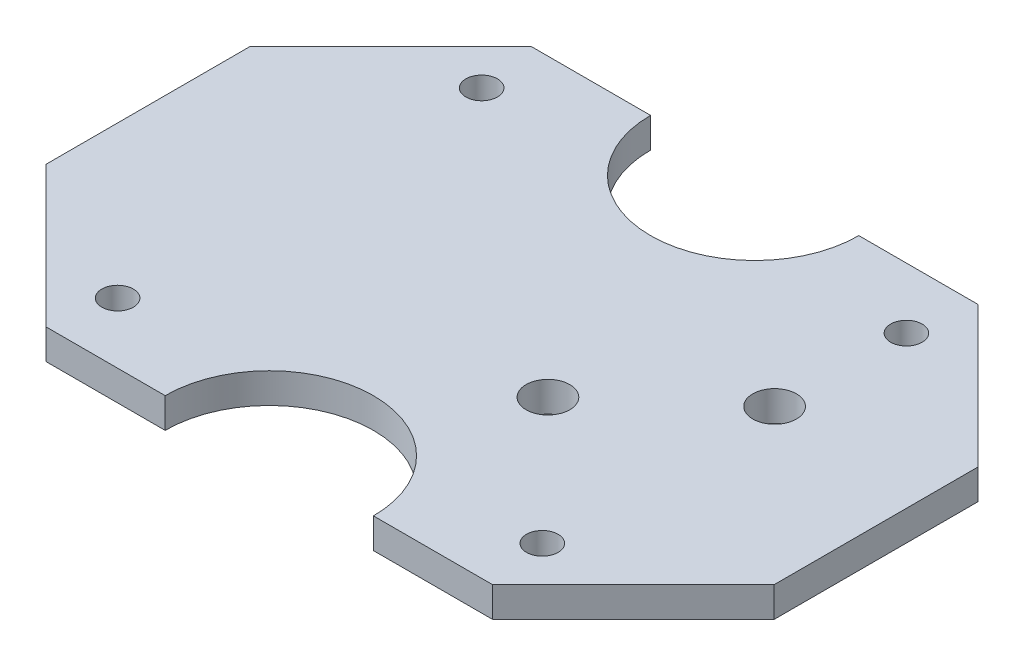
ISO-10303-21;
HEADER;
FILE_DESCRIPTION(('STEP AP214'),'2;1');
FILE_NAME('part.step','',(''),(''),'','','');
FILE_SCHEMA(('AUTOMOTIVE_DESIGN { 1 0 10303 214 1 1 1 1 }'));
ENDSEC;
DATA;
#1=APPLICATION_CONTEXT('core data for automotive mechanical design processes');
#2=APPLICATION_PROTOCOL_DEFINITION('international standard','automotive_design',2000,#1);
#3=PRODUCT_CONTEXT('',#1,'mechanical');
#4=PRODUCT('Part','Part','',(#3));
#5=PRODUCT_RELATED_PRODUCT_CATEGORY('part','',(#4));
#6=PRODUCT_DEFINITION_FORMATION('','',#4);
#7=PRODUCT_DEFINITION_CONTEXT('part definition',#1,'design');
#8=PRODUCT_DEFINITION('design','',#6,#7);
#9=PRODUCT_DEFINITION_SHAPE('','',#8);
#10=(LENGTH_UNIT() NAMED_UNIT(*) SI_UNIT(.MILLI.,.METRE.));
#11=(NAMED_UNIT(*) PLANE_ANGLE_UNIT() SI_UNIT($,.RADIAN.));
#12=(NAMED_UNIT(*) SI_UNIT($,.STERADIAN.) SOLID_ANGLE_UNIT());
#13=UNCERTAINTY_MEASURE_WITH_UNIT(LENGTH_MEASURE(1.E-05),#10,'distance_accuracy_value','');
#14=(GEOMETRIC_REPRESENTATION_CONTEXT(3) GLOBAL_UNCERTAINTY_ASSIGNED_CONTEXT((#13)) GLOBAL_UNIT_ASSIGNED_CONTEXT((#10,
#11,#12)) REPRESENTATION_CONTEXT('',''));
#15=CARTESIAN_POINT('',(0.,0.,0.));
#16=DIRECTION('',(0.,0.,1.));
#17=DIRECTION('',(1.,0.,0.));
#18=AXIS2_PLACEMENT_3D('',#15,#16,#17);
#19=CARTESIAN_POINT('',(0.,3.1496,25.4));
#20=DIRECTION('',(0.,-1.,0.));
#21=DIRECTION('',(0.,0.,-1.));
#22=AXIS2_PLACEMENT_3D('',#19,#20,#21);
#23=PLANE('',#22);
#24=CARTESIAN_POINT('',(9.27099999999997,3.1496,5.5118));
#25=DIRECTION('',(0.,1.,0.));
#26=DIRECTION('',(0.,0.,1.));
#27=AXIS2_PLACEMENT_3D('',#24,#25,#26);
#28=CIRCLE('',#27,2.286);
#29=CARTESIAN_POINT('',(9.27099999999997,3.1496,7.7978));
#30=VERTEX_POINT('',#29);
#31=EDGE_CURVE('E300',#30,#30,#28,.T.);
#32=ORIENTED_EDGE('',*,*,#31,.F.);
#33=EDGE_LOOP('',(#32));
#34=FACE_BOUND('',#33,.T.);
#35=CARTESIAN_POINT('',(22.225,3.1496,19.05));
#36=DIRECTION('',(0.,1.,0.));
#37=DIRECTION('',(0.,0.,1.));
#38=AXIS2_PLACEMENT_3D('',#35,#36,#37);
#39=CIRCLE('',#38,1.651);
#40=CARTESIAN_POINT('',(22.225,3.1496,20.701));
#41=VERTEX_POINT('',#40);
#42=EDGE_CURVE('E312',#41,#41,#39,.T.);
#43=ORIENTED_EDGE('',*,*,#42,.F.);
#44=EDGE_LOOP('',(#43));
#45=FACE_BOUND('',#44,.T.);
#46=CARTESIAN_POINT('',(-22.225,3.1496,-19.05));
#47=DIRECTION('',(0.,1.,0.));
#48=DIRECTION('',(0.,0.,1.));
#49=AXIS2_PLACEMENT_3D('',#46,#47,#48);
#50=CIRCLE('',#49,1.651);
#51=CARTESIAN_POINT('',(-22.225,3.1496,-17.399));
#52=VERTEX_POINT('',#51);
#53=EDGE_CURVE('E158',#52,#52,#50,.T.);
#54=ORIENTED_EDGE('',*,*,#53,.F.);
#55=EDGE_LOOP('',(#54));
#56=FACE_BOUND('',#55,.T.);
#57=DIRECTION('',(-1.,0.,0.));
#58=VECTOR('',#57,1.);
#59=CARTESIAN_POINT('',(10.8996556321968,3.1496,-25.4));
#60=LINE('',#59,#58);
#61=CARTESIAN_POINT('',(23.3680000000001,3.1496,-25.4));
#62=VERTEX_POINT('',#61);
#63=CARTESIAN_POINT('',(10.8996556321968,3.1496,-25.4));
#64=VERTEX_POINT('',#63);
#65=EDGE_CURVE('E177',#62,#64,#60,.T.);
#66=ORIENTED_EDGE('',*,*,#65,.T.);
#67=CARTESIAN_POINT('',(0.,3.1496,-25.4));
#68=DIRECTION('',(0.,-1.,0.));
#69=DIRECTION('',(0.,0.,-1.));
#70=AXIS2_PLACEMENT_3D('',#67,#68,#69);
#71=CIRCLE('',#70,10.8996556321968);
#72=CARTESIAN_POINT('',(-10.8996556321968,3.1496,-25.4));
#73=VERTEX_POINT('',#72);
#74=EDGE_CURVE('E105',#64,#73,#71,.T.);
#75=ORIENTED_EDGE('',*,*,#74,.T.);
#76=DIRECTION('',(-1.,0.,0.));
#77=VECTOR('',#76,1.);
#78=CARTESIAN_POINT('',(-23.3680000000001,3.1496,-25.4));
#79=LINE('',#78,#77);
#80=CARTESIAN_POINT('',(-23.3680000000001,3.1496,-25.4));
#81=VERTEX_POINT('',#80);
#82=EDGE_CURVE('E204',#73,#81,#79,.T.);
#83=ORIENTED_EDGE('',*,*,#82,.T.);
#84=DIRECTION('',(-0.707106781186546,0.,0.707106781186549));
#85=VECTOR('',#84,1.);
#86=CARTESIAN_POINT('',(-23.3680000000001,3.1496,-25.4));
#87=LINE('',#86,#85);
#88=CARTESIAN_POINT('',(-38.1,3.1496,-10.668));
#89=VERTEX_POINT('',#88);
#90=EDGE_CURVE('E223',#81,#89,#87,.T.);
#91=ORIENTED_EDGE('',*,*,#90,.T.);
#92=DIRECTION('',(0.,0.,1.));
#93=VECTOR('',#92,1.);
#94=CARTESIAN_POINT('',(-38.1,3.1496,-10.668));
#95=LINE('',#94,#93);
#96=CARTESIAN_POINT('',(-38.1,3.1496,10.668));
#97=VERTEX_POINT('',#96);
#98=EDGE_CURVE('E220',#89,#97,#95,.T.);
#99=ORIENTED_EDGE('',*,*,#98,.T.);
#100=DIRECTION('',(0.707106781186546,0.,0.707106781186549));
#101=VECTOR('',#100,1.);
#102=CARTESIAN_POINT('',(-23.3680000000001,3.1496,25.4));
#103=LINE('',#102,#101);
#104=CARTESIAN_POINT('',(-23.3680000000001,3.1496,25.4));
#105=VERTEX_POINT('',#104);
#106=EDGE_CURVE('E222',#97,#105,#103,.T.);
#107=ORIENTED_EDGE('',*,*,#106,.T.);
#108=DIRECTION('',(1.,0.,0.));
#109=VECTOR('',#108,1.);
#110=CARTESIAN_POINT('',(-23.3680000000001,3.1496,25.4));
#111=LINE('',#110,#109);
#112=CARTESIAN_POINT('',(-10.8996556321968,3.1496,25.4));
#113=VERTEX_POINT('',#112);
#114=EDGE_CURVE('E225',#105,#113,#111,.T.);
#115=ORIENTED_EDGE('',*,*,#114,.T.);
#116=CARTESIAN_POINT('',(0.,3.1496,25.4));
#117=DIRECTION('',(0.,-1.,0.));
#118=DIRECTION('',(0.,0.,-1.));
#119=AXIS2_PLACEMENT_3D('',#116,#117,#118);
#120=CIRCLE('',#119,10.8996556321968);
#121=CARTESIAN_POINT('',(10.8996556321968,3.1496,25.4));
#122=VERTEX_POINT('',#121);
#123=EDGE_CURVE('E231',#113,#122,#120,.T.);
#124=ORIENTED_EDGE('',*,*,#123,.T.);
#125=DIRECTION('',(1.,0.,0.));
#126=VECTOR('',#125,1.);
#127=CARTESIAN_POINT('',(10.8996556321968,3.1496,25.4));
#128=LINE('',#127,#126);
#129=CARTESIAN_POINT('',(23.3680000000001,3.1496,25.4));
#130=VERTEX_POINT('',#129);
#131=EDGE_CURVE('E136',#122,#130,#128,.T.);
#132=ORIENTED_EDGE('',*,*,#131,.T.);
#133=DIRECTION('',(0.707106781186545,0.,-0.70710678118655));
#134=VECTOR('',#133,1.);
#135=CARTESIAN_POINT('',(23.3680000000001,3.1496,25.4));
#136=LINE('',#135,#134);
#137=CARTESIAN_POINT('',(38.1,3.1496,10.668));
#138=VERTEX_POINT('',#137);
#139=EDGE_CURVE('E130',#130,#138,#136,.T.);
#140=ORIENTED_EDGE('',*,*,#139,.T.);
#141=DIRECTION('',(0.,0.,-1.));
#142=VECTOR('',#141,1.);
#143=CARTESIAN_POINT('',(38.1,3.1496,-10.668));
#144=LINE('',#143,#142);
#145=CARTESIAN_POINT('',(38.1,3.1496,-10.668));
#146=VERTEX_POINT('',#145);
#147=EDGE_CURVE('E134',#138,#146,#144,.T.);
#148=ORIENTED_EDGE('',*,*,#147,.T.);
#149=DIRECTION('',(-0.707106781186545,0.,-0.70710678118655));
#150=VECTOR('',#149,1.);
#151=CARTESIAN_POINT('',(23.3680000000001,3.1496,-25.4));
#152=LINE('',#151,#150);
#153=EDGE_CURVE('E50',#146,#62,#152,.T.);
#154=ORIENTED_EDGE('',*,*,#153,.T.);
#155=EDGE_LOOP('',(#66,#75,#83,#91,#99,#107,#115,#124,#132,#140,#148,#154));
#156=FACE_BOUND('',#155,.T.);
#157=CARTESIAN_POINT('',(22.225,3.1496,-19.05));
#158=DIRECTION('',(0.,1.,0.));
#159=DIRECTION('',(0.,0.,1.));
#160=AXIS2_PLACEMENT_3D('',#157,#158,#159);
#161=CIRCLE('',#160,1.651);
#162=CARTESIAN_POINT('',(22.225,3.1496,-17.399));
#163=VERTEX_POINT('',#162);
#164=EDGE_CURVE('E318',#163,#163,#161,.T.);
#165=ORIENTED_EDGE('',*,*,#164,.F.);
#166=EDGE_LOOP('',(#165));
#167=FACE_BOUND('',#166,.T.);
#168=CARTESIAN_POINT('',(-22.225,3.1496,19.05));
#169=DIRECTION('',(0.,1.,0.));
#170=DIRECTION('',(0.,0.,1.));
#171=AXIS2_PLACEMENT_3D('',#168,#169,#170);
#172=CIRCLE('',#171,1.651);
#173=CARTESIAN_POINT('',(-22.225,3.1496,20.701));
#174=VERTEX_POINT('',#173);
#175=EDGE_CURVE('E306',#174,#174,#172,.T.);
#176=ORIENTED_EDGE('',*,*,#175,.F.);
#177=EDGE_LOOP('',(#176));
#178=FACE_BOUND('',#177,.T.);
#179=CARTESIAN_POINT('',(21.971,3.1496,-5.5118));
#180=DIRECTION('',(0.,1.,0.));
#181=DIRECTION('',(0.,0.,1.));
#182=AXIS2_PLACEMENT_3D('',#179,#180,#181);
#183=CIRCLE('',#182,2.286);
#184=CARTESIAN_POINT('',(21.971,3.1496,-3.2258));
#185=VERTEX_POINT('',#184);
#186=EDGE_CURVE('E291',#185,#185,#183,.T.);
#187=ORIENTED_EDGE('',*,*,#186,.F.);
#188=EDGE_LOOP('',(#187));
#189=FACE_BOUND('',#188,.T.);
#190=ADVANCED_FACE('F33',(#34,#45,#56,#156,#167,#178,#189),#23,.F.);
#191=CARTESIAN_POINT('',(0.,0.,25.4));
#192=DIRECTION('',(0.,-1.,0.));
#193=DIRECTION('',(0.,0.,-1.));
#194=AXIS2_PLACEMENT_3D('',#191,#192,#193);
#195=PLANE('',#194);
#196=CARTESIAN_POINT('',(9.27099999999997,0.,5.5118));
#197=DIRECTION('',(0.,1.,0.));
#198=DIRECTION('',(0.,0.,1.));
#199=AXIS2_PLACEMENT_3D('',#196,#197,#198);
#200=CIRCLE('',#199,2.286);
#201=CARTESIAN_POINT('',(9.27099999999997,0.,7.7978));
#202=VERTEX_POINT('',#201);
#203=EDGE_CURVE('E297',#202,#202,#200,.T.);
#204=ORIENTED_EDGE('',*,*,#203,.T.);
#205=EDGE_LOOP('',(#204));
#206=FACE_BOUND('',#205,.T.);
#207=CARTESIAN_POINT('',(22.225,0.,19.05));
#208=DIRECTION('',(0.,1.,0.));
#209=DIRECTION('',(0.,0.,1.));
#210=AXIS2_PLACEMENT_3D('',#207,#208,#209);
#211=CIRCLE('',#210,1.651);
#212=CARTESIAN_POINT('',(22.225,0.,20.701));
#213=VERTEX_POINT('',#212);
#214=EDGE_CURVE('E309',#213,#213,#211,.T.);
#215=ORIENTED_EDGE('',*,*,#214,.T.);
#216=EDGE_LOOP('',(#215));
#217=FACE_BOUND('',#216,.T.);
#218=CARTESIAN_POINT('',(-22.225,0.,-19.05));
#219=DIRECTION('',(0.,1.,0.));
#220=DIRECTION('',(0.,0.,1.));
#221=AXIS2_PLACEMENT_3D('',#218,#219,#220);
#222=CIRCLE('',#221,1.651);
#223=CARTESIAN_POINT('',(-22.225,0.,-17.399));
#224=VERTEX_POINT('',#223);
#225=EDGE_CURVE('E321',#224,#224,#222,.T.);
#226=ORIENTED_EDGE('',*,*,#225,.T.);
#227=EDGE_LOOP('',(#226));
#228=FACE_BOUND('',#227,.T.);
#229=DIRECTION('',(-1.,0.,0.));
#230=VECTOR('',#229,1.);
#231=CARTESIAN_POINT('',(10.8996556321968,0.,-25.4));
#232=LINE('',#231,#230);
#233=CARTESIAN_POINT('',(23.3680000000001,0.,-25.4));
#234=VERTEX_POINT('',#233);
#235=CARTESIAN_POINT('',(10.8996556321968,0.,-25.4));
#236=VERTEX_POINT('',#235);
#237=EDGE_CURVE('E154',#234,#236,#232,.T.);
#238=ORIENTED_EDGE('',*,*,#237,.F.);
#239=DIRECTION('',(-0.707106781186545,0.,-0.70710678118655));
#240=VECTOR('',#239,1.);
#241=CARTESIAN_POINT('',(23.3680000000001,0.,-25.4));
#242=LINE('',#241,#240);
#243=CARTESIAN_POINT('',(38.1,0.,-10.668));
#244=VERTEX_POINT('',#243);
#245=EDGE_CURVE('E97',#244,#234,#242,.T.);
#246=ORIENTED_EDGE('',*,*,#245,.F.);
#247=DIRECTION('',(0.,0.,-1.));
#248=VECTOR('',#247,1.);
#249=CARTESIAN_POINT('',(38.1,0.,-10.668));
#250=LINE('',#249,#248);
#251=CARTESIAN_POINT('',(38.1,0.,10.668));
#252=VERTEX_POINT('',#251);
#253=EDGE_CURVE('E91',#252,#244,#250,.T.);
#254=ORIENTED_EDGE('',*,*,#253,.F.);
#255=DIRECTION('',(0.707106781186545,0.,-0.70710678118655));
#256=VECTOR('',#255,1.);
#257=CARTESIAN_POINT('',(23.3680000000001,0.,25.4));
#258=LINE('',#257,#256);
#259=CARTESIAN_POINT('',(23.3680000000001,0.,25.4));
#260=VERTEX_POINT('',#259);
#261=EDGE_CURVE('E144',#260,#252,#258,.T.);
#262=ORIENTED_EDGE('',*,*,#261,.F.);
#263=DIRECTION('',(1.,0.,0.));
#264=VECTOR('',#263,1.);
#265=CARTESIAN_POINT('',(10.8996556321968,0.,25.4));
#266=LINE('',#265,#264);
#267=CARTESIAN_POINT('',(10.8996556321968,0.,25.4));
#268=VERTEX_POINT('',#267);
#269=EDGE_CURVE('E172',#268,#260,#266,.T.);
#270=ORIENTED_EDGE('',*,*,#269,.F.);
#271=CARTESIAN_POINT('',(0.,0.,25.4));
#272=DIRECTION('',(0.,-1.,0.));
#273=DIRECTION('',(0.,0.,-1.));
#274=AXIS2_PLACEMENT_3D('',#271,#272,#273);
#275=CIRCLE('',#274,10.8996556321968);
#276=CARTESIAN_POINT('',(-10.8996556321968,0.,25.4));
#277=VERTEX_POINT('',#276);
#278=EDGE_CURVE('E170',#277,#268,#275,.T.);
#279=ORIENTED_EDGE('',*,*,#278,.F.);
#280=DIRECTION('',(1.,0.,0.));
#281=VECTOR('',#280,1.);
#282=CARTESIAN_POINT('',(-23.3680000000001,0.,25.4));
#283=LINE('',#282,#281);
#284=CARTESIAN_POINT('',(-23.3680000000001,0.,25.4));
#285=VERTEX_POINT('',#284);
#286=EDGE_CURVE('E168',#285,#277,#283,.T.);
#287=ORIENTED_EDGE('',*,*,#286,.F.);
#288=DIRECTION('',(0.707106781186546,0.,0.707106781186549));
#289=VECTOR('',#288,1.);
#290=CARTESIAN_POINT('',(-23.3680000000001,0.,25.4));
#291=LINE('',#290,#289);
#292=CARTESIAN_POINT('',(-38.1,0.,10.668));
#293=VERTEX_POINT('',#292);
#294=EDGE_CURVE('E166',#293,#285,#291,.T.);
#295=ORIENTED_EDGE('',*,*,#294,.F.);
#296=DIRECTION('',(0.,0.,1.));
#297=VECTOR('',#296,1.);
#298=CARTESIAN_POINT('',(-38.1,0.,-10.668));
#299=LINE('',#298,#297);
#300=CARTESIAN_POINT('',(-38.1,0.,-10.668));
#301=VERTEX_POINT('',#300);
#302=EDGE_CURVE('E164',#301,#293,#299,.T.);
#303=ORIENTED_EDGE('',*,*,#302,.F.);
#304=DIRECTION('',(-0.707106781186546,0.,0.707106781186549));
#305=VECTOR('',#304,1.);
#306=CARTESIAN_POINT('',(-23.3680000000001,0.,-25.4));
#307=LINE('',#306,#305);
#308=CARTESIAN_POINT('',(-23.3680000000001,0.,-25.4));
#309=VERTEX_POINT('',#308);
#310=EDGE_CURVE('E162',#309,#301,#307,.T.);
#311=ORIENTED_EDGE('',*,*,#310,.F.);
#312=DIRECTION('',(-1.,0.,0.));
#313=VECTOR('',#312,1.);
#314=CARTESIAN_POINT('',(-23.3680000000001,0.,-25.4));
#315=LINE('',#314,#313);
#316=CARTESIAN_POINT('',(-10.8996556321968,0.,-25.4));
#317=VERTEX_POINT('',#316);
#318=EDGE_CURVE('E160',#317,#309,#315,.T.);
#319=ORIENTED_EDGE('',*,*,#318,.F.);
#320=CARTESIAN_POINT('',(0.,0.,-25.4));
#321=DIRECTION('',(0.,-1.,0.));
#322=DIRECTION('',(0.,0.,-1.));
#323=AXIS2_PLACEMENT_3D('',#320,#321,#322);
#324=CIRCLE('',#323,10.8996556321968);
#325=EDGE_CURVE('E157',#236,#317,#324,.T.);
#326=ORIENTED_EDGE('',*,*,#325,.F.);
#327=EDGE_LOOP('',(#238,#246,#254,#262,#270,#279,#287,#295,#303,#311,#319,#326));
#328=FACE_BOUND('',#327,.T.);
#329=CARTESIAN_POINT('',(22.225,0.,-19.05));
#330=DIRECTION('',(0.,1.,0.));
#331=DIRECTION('',(0.,0.,1.));
#332=AXIS2_PLACEMENT_3D('',#329,#330,#331);
#333=CIRCLE('',#332,1.651);
#334=CARTESIAN_POINT('',(22.225,0.,-17.399));
#335=VERTEX_POINT('',#334);
#336=EDGE_CURVE('E315',#335,#335,#333,.T.);
#337=ORIENTED_EDGE('',*,*,#336,.T.);
#338=EDGE_LOOP('',(#337));
#339=FACE_BOUND('',#338,.T.);
#340=CARTESIAN_POINT('',(-22.225,0.,19.05));
#341=DIRECTION('',(0.,1.,0.));
#342=DIRECTION('',(0.,0.,1.));
#343=AXIS2_PLACEMENT_3D('',#340,#341,#342);
#344=CIRCLE('',#343,1.651);
#345=CARTESIAN_POINT('',(-22.225,0.,20.701));
#346=VERTEX_POINT('',#345);
#347=EDGE_CURVE('E303',#346,#346,#344,.T.);
#348=ORIENTED_EDGE('',*,*,#347,.T.);
#349=EDGE_LOOP('',(#348));
#350=FACE_BOUND('',#349,.T.);
#351=CARTESIAN_POINT('',(21.971,0.,-5.5118));
#352=DIRECTION('',(0.,1.,0.));
#353=DIRECTION('',(0.,0.,1.));
#354=AXIS2_PLACEMENT_3D('',#351,#352,#353);
#355=CIRCLE('',#354,2.286);
#356=CARTESIAN_POINT('',(21.971,0.,-3.2258));
#357=VERTEX_POINT('',#356);
#358=EDGE_CURVE('E294',#357,#357,#355,.T.);
#359=ORIENTED_EDGE('',*,*,#358,.T.);
#360=EDGE_LOOP('',(#359));
#361=FACE_BOUND('',#360,.T.);
#362=ADVANCED_FACE('F208',(#206,#217,#228,#328,#339,#350,#361),#195,.T.);
#363=CARTESIAN_POINT('',(10.8996556321968,3.1496,-25.4));
#364=DIRECTION('',(0.,0.,1.));
#365=DIRECTION('',(1.,0.,0.));
#366=AXIS2_PLACEMENT_3D('',#363,#364,#365);
#367=PLANE('',#366);
#368=ORIENTED_EDGE('',*,*,#237,.T.);
#369=DIRECTION('',(0.,-1.,0.));
#370=VECTOR('',#369,1.);
#371=CARTESIAN_POINT('',(10.8996556321968,3.1496,-25.4));
#372=LINE('',#371,#370);
#373=EDGE_CURVE('E11',#64,#236,#372,.T.);
#374=ORIENTED_EDGE('',*,*,#373,.F.);
#375=ORIENTED_EDGE('',*,*,#65,.F.);
#376=DIRECTION('',(0.,-1.,0.));
#377=VECTOR('',#376,1.);
#378=CARTESIAN_POINT('',(23.3680000000001,3.1496,-25.4));
#379=LINE('',#378,#377);
#380=EDGE_CURVE('E150',#62,#234,#379,.T.);
#381=ORIENTED_EDGE('',*,*,#380,.T.);
#382=EDGE_LOOP('',(#368,#374,#375,#381));
#383=FACE_BOUND('',#382,.T.);
#384=ADVANCED_FACE('F35',(#383),#367,.F.);
#385=CARTESIAN_POINT('',(0.,3.1496,-25.4));
#386=DIRECTION('',(0.,-1.,0.));
#387=DIRECTION('',(0.,0.,-1.));
#388=AXIS2_PLACEMENT_3D('',#385,#386,#387);
#389=CYLINDRICAL_SURFACE('',#388,10.8996556321968);
#390=ORIENTED_EDGE('',*,*,#325,.T.);
#391=DIRECTION('',(0.,-1.,0.));
#392=VECTOR('',#391,1.);
#393=CARTESIAN_POINT('',(-10.8996556321968,3.1496,-25.4));
#394=LINE('',#393,#392);
#395=EDGE_CURVE('E42',#73,#317,#394,.T.);
#396=ORIENTED_EDGE('',*,*,#395,.F.);
#397=ORIENTED_EDGE('',*,*,#74,.F.);
#398=ORIENTED_EDGE('',*,*,#373,.T.);
#399=EDGE_LOOP('',(#390,#396,#397,#398));
#400=FACE_BOUND('',#399,.T.);
#401=ADVANCED_FACE('F448',(#400),#389,.F.);
#402=CARTESIAN_POINT('',(-23.3680000000001,3.1496,-25.4));
#403=DIRECTION('',(0.,0.,1.));
#404=DIRECTION('',(1.,0.,0.));
#405=AXIS2_PLACEMENT_3D('',#402,#403,#404);
#406=PLANE('',#405);
#407=ORIENTED_EDGE('',*,*,#318,.T.);
#408=DIRECTION('',(0.,-1.,0.));
#409=VECTOR('',#408,1.);
#410=CARTESIAN_POINT('',(-23.3680000000001,3.1496,-25.4));
#411=LINE('',#410,#409);
#412=EDGE_CURVE('E196',#81,#309,#411,.T.);
#413=ORIENTED_EDGE('',*,*,#412,.F.);
#414=ORIENTED_EDGE('',*,*,#82,.F.);
#415=ORIENTED_EDGE('',*,*,#395,.T.);
#416=EDGE_LOOP('',(#407,#413,#414,#415));
#417=FACE_BOUND('',#416,.T.);
#418=ADVANCED_FACE('F202',(#417),#406,.F.);
#419=CARTESIAN_POINT('',(-23.3680000000001,3.1496,-25.4));
#420=DIRECTION('',(0.707106781186549,0.,0.707106781186546));
#421=DIRECTION('',(0.707106781186546,0.,-0.707106781186549));
#422=AXIS2_PLACEMENT_3D('',#419,#420,#421);
#423=PLANE('',#422);
#424=ORIENTED_EDGE('',*,*,#310,.T.);
#425=DIRECTION('',(0.,-1.,0.));
#426=VECTOR('',#425,1.);
#427=CARTESIAN_POINT('',(-38.1,3.1496,-10.668));
#428=LINE('',#427,#426);
#429=EDGE_CURVE('E193',#89,#301,#428,.T.);
#430=ORIENTED_EDGE('',*,*,#429,.F.);
#431=ORIENTED_EDGE('',*,*,#90,.F.);
#432=ORIENTED_EDGE('',*,*,#412,.T.);
#433=EDGE_LOOP('',(#424,#430,#431,#432));
#434=FACE_BOUND('',#433,.T.);
#435=ADVANCED_FACE('F214',(#434),#423,.F.);
#436=CARTESIAN_POINT('',(-38.1,3.1496,-10.668));
#437=DIRECTION('',(1.,0.,0.));
#438=DIRECTION('',(0.,0.,-1.));
#439=AXIS2_PLACEMENT_3D('',#436,#437,#438);
#440=PLANE('',#439);
#441=ORIENTED_EDGE('',*,*,#302,.T.);
#442=DIRECTION('',(0.,-1.,0.));
#443=VECTOR('',#442,1.);
#444=CARTESIAN_POINT('',(-38.1,3.1496,10.668));
#445=LINE('',#444,#443);
#446=EDGE_CURVE('E190',#97,#293,#445,.T.);
#447=ORIENTED_EDGE('',*,*,#446,.F.);
#448=ORIENTED_EDGE('',*,*,#98,.F.);
#449=ORIENTED_EDGE('',*,*,#429,.T.);
#450=EDGE_LOOP('',(#441,#447,#448,#449));
#451=FACE_BOUND('',#450,.T.);
#452=ADVANCED_FACE('F218',(#451),#440,.F.);
#453=CARTESIAN_POINT('',(-23.3680000000001,3.1496,25.4));
#454=DIRECTION('',(0.707106781186549,0.,-0.707106781186546));
#455=DIRECTION('',(-0.707106781186546,0.,-0.707106781186549));
#456=AXIS2_PLACEMENT_3D('',#453,#454,#455);
#457=PLANE('',#456);
#458=ORIENTED_EDGE('',*,*,#294,.T.);
#459=DIRECTION('',(0.,-1.,0.));
#460=VECTOR('',#459,1.);
#461=CARTESIAN_POINT('',(-23.3680000000001,3.1496,25.4));
#462=LINE('',#461,#460);
#463=EDGE_CURVE('E187',#105,#285,#462,.T.);
#464=ORIENTED_EDGE('',*,*,#463,.F.);
#465=ORIENTED_EDGE('',*,*,#106,.F.);
#466=ORIENTED_EDGE('',*,*,#446,.T.);
#467=EDGE_LOOP('',(#458,#464,#465,#466));
#468=FACE_BOUND('',#467,.T.);
#469=ADVANCED_FACE('F413',(#468),#457,.F.);
#470=CARTESIAN_POINT('',(-23.3680000000001,3.1496,25.4));
#471=DIRECTION('',(0.,0.,-1.));
#472=DIRECTION('',(-1.,0.,0.));
#473=AXIS2_PLACEMENT_3D('',#470,#471,#472);
#474=PLANE('',#473);
#475=ORIENTED_EDGE('',*,*,#286,.T.);
#476=DIRECTION('',(0.,-1.,0.));
#477=VECTOR('',#476,1.);
#478=CARTESIAN_POINT('',(-10.8996556321968,3.1496,25.4));
#479=LINE('',#478,#477);
#480=EDGE_CURVE('E184',#113,#277,#479,.T.);
#481=ORIENTED_EDGE('',*,*,#480,.F.);
#482=ORIENTED_EDGE('',*,*,#114,.F.);
#483=ORIENTED_EDGE('',*,*,#463,.T.);
#484=EDGE_LOOP('',(#475,#481,#482,#483));
#485=FACE_BOUND('',#484,.T.);
#486=ADVANCED_FACE('F404',(#485),#474,.F.);
#487=CARTESIAN_POINT('',(0.,3.1496,25.4));
#488=DIRECTION('',(0.,-1.,0.));
#489=DIRECTION('',(0.,0.,-1.));
#490=AXIS2_PLACEMENT_3D('',#487,#488,#489);
#491=CYLINDRICAL_SURFACE('',#490,10.8996556321968);
#492=ORIENTED_EDGE('',*,*,#278,.T.);
#493=DIRECTION('',(0.,-1.,0.));
#494=VECTOR('',#493,1.);
#495=CARTESIAN_POINT('',(10.8996556321968,3.1496,25.4));
#496=LINE('',#495,#494);
#497=EDGE_CURVE('E181',#122,#268,#496,.T.);
#498=ORIENTED_EDGE('',*,*,#497,.F.);
#499=ORIENTED_EDGE('',*,*,#123,.F.);
#500=ORIENTED_EDGE('',*,*,#480,.T.);
#501=EDGE_LOOP('',(#492,#498,#499,#500));
#502=FACE_BOUND('',#501,.T.);
#503=ADVANCED_FACE('F237',(#502),#491,.F.);
#504=CARTESIAN_POINT('',(10.8996556321968,3.1496,25.4));
#505=DIRECTION('',(0.,0.,-1.));
#506=DIRECTION('',(-1.,0.,0.));
#507=AXIS2_PLACEMENT_3D('',#504,#505,#506);
#508=PLANE('',#507);
#509=ORIENTED_EDGE('',*,*,#269,.T.);
#510=DIRECTION('',(0.,-1.,0.));
#511=VECTOR('',#510,1.);
#512=CARTESIAN_POINT('',(23.3680000000001,3.1496,25.4));
#513=LINE('',#512,#511);
#514=EDGE_CURVE('E145',#130,#260,#513,.T.);
#515=ORIENTED_EDGE('',*,*,#514,.F.);
#516=ORIENTED_EDGE('',*,*,#131,.F.);
#517=ORIENTED_EDGE('',*,*,#497,.T.);
#518=EDGE_LOOP('',(#509,#515,#516,#517));
#519=FACE_BOUND('',#518,.T.);
#520=ADVANCED_FACE('F241',(#519),#508,.F.);
#521=CARTESIAN_POINT('',(23.3680000000001,3.1496,25.4));
#522=DIRECTION('',(-0.70710678118655,0.,-0.707106781186545));
#523=DIRECTION('',(-0.707106781186545,0.,0.70710678118655));
#524=AXIS2_PLACEMENT_3D('',#521,#522,#523);
#525=PLANE('',#524);
#526=ORIENTED_EDGE('',*,*,#261,.T.);
#527=DIRECTION('',(0.,-1.,0.));
#528=VECTOR('',#527,1.);
#529=CARTESIAN_POINT('',(38.1,3.1496,10.668));
#530=LINE('',#529,#528);
#531=EDGE_CURVE('E141',#138,#252,#530,.T.);
#532=ORIENTED_EDGE('',*,*,#531,.F.);
#533=ORIENTED_EDGE('',*,*,#139,.F.);
#534=ORIENTED_EDGE('',*,*,#514,.T.);
#535=EDGE_LOOP('',(#526,#532,#533,#534));
#536=FACE_BOUND('',#535,.T.);
#537=ADVANCED_FACE('F142',(#536),#525,.F.);
#538=CARTESIAN_POINT('',(38.1,3.1496,-10.668));
#539=DIRECTION('',(-1.,0.,0.));
#540=DIRECTION('',(0.,0.,1.));
#541=AXIS2_PLACEMENT_3D('',#538,#539,#540);
#542=PLANE('',#541);
#543=ORIENTED_EDGE('',*,*,#253,.T.);
#544=DIRECTION('',(0.,-1.,0.));
#545=VECTOR('',#544,1.);
#546=CARTESIAN_POINT('',(38.1,3.1496,-10.668));
#547=LINE('',#546,#545);
#548=EDGE_CURVE('E146',#146,#244,#547,.T.);
#549=ORIENTED_EDGE('',*,*,#548,.F.);
#550=ORIENTED_EDGE('',*,*,#147,.F.);
#551=ORIENTED_EDGE('',*,*,#531,.T.);
#552=EDGE_LOOP('',(#543,#549,#550,#551));
#553=FACE_BOUND('',#552,.T.);
#554=ADVANCED_FACE('F148',(#553),#542,.F.);
#555=CARTESIAN_POINT('',(23.3680000000001,3.1496,-25.4));
#556=DIRECTION('',(-0.70710678118655,0.,0.707106781186545));
#557=DIRECTION('',(0.707106781186545,0.,0.70710678118655));
#558=AXIS2_PLACEMENT_3D('',#555,#556,#557);
#559=PLANE('',#558);
#560=ORIENTED_EDGE('',*,*,#245,.T.);
#561=ORIENTED_EDGE('',*,*,#380,.F.);
#562=ORIENTED_EDGE('',*,*,#153,.F.);
#563=ORIENTED_EDGE('',*,*,#548,.T.);
#564=EDGE_LOOP('',(#560,#561,#562,#563));
#565=FACE_BOUND('',#564,.T.);
#566=ADVANCED_FACE('F245',(#565),#559,.F.);
#567=CARTESIAN_POINT('',(-22.225,3.1496,-19.05));
#568=DIRECTION('',(0.,-1.,0.));
#569=DIRECTION('',(0.,0.,-1.));
#570=AXIS2_PLACEMENT_3D('',#567,#568,#569);
#571=CYLINDRICAL_SURFACE('',#570,1.651);
#572=ORIENTED_EDGE('',*,*,#53,.T.);
#573=EDGE_LOOP('',(#572));
#574=FACE_BOUND('',#573,.T.);
#575=ORIENTED_EDGE('',*,*,#225,.F.);
#576=EDGE_LOOP('',(#575));
#577=FACE_BOUND('',#576,.T.);
#578=ADVANCED_FACE('F247',(#574,#577),#571,.F.);
#579=CARTESIAN_POINT('',(22.225,3.1496,-19.05));
#580=DIRECTION('',(0.,-1.,0.));
#581=DIRECTION('',(0.,0.,-1.));
#582=AXIS2_PLACEMENT_3D('',#579,#580,#581);
#583=CYLINDRICAL_SURFACE('',#582,1.651);
#584=ORIENTED_EDGE('',*,*,#164,.T.);
#585=EDGE_LOOP('',(#584));
#586=FACE_BOUND('',#585,.T.);
#587=ORIENTED_EDGE('',*,*,#336,.F.);
#588=EDGE_LOOP('',(#587));
#589=FACE_BOUND('',#588,.T.);
#590=ADVANCED_FACE('F253',(#586,#589),#583,.F.);
#591=CARTESIAN_POINT('',(22.225,3.1496,19.05));
#592=DIRECTION('',(0.,-1.,0.));
#593=DIRECTION('',(0.,0.,-1.));
#594=AXIS2_PLACEMENT_3D('',#591,#592,#593);
#595=CYLINDRICAL_SURFACE('',#594,1.651);
#596=ORIENTED_EDGE('',*,*,#42,.T.);
#597=EDGE_LOOP('',(#596));
#598=FACE_BOUND('',#597,.T.);
#599=ORIENTED_EDGE('',*,*,#214,.F.);
#600=EDGE_LOOP('',(#599));
#601=FACE_BOUND('',#600,.T.);
#602=ADVANCED_FACE('F270',(#598,#601),#595,.F.);
#603=CARTESIAN_POINT('',(-22.225,3.1496,19.05));
#604=DIRECTION('',(0.,-1.,0.));
#605=DIRECTION('',(0.,0.,-1.));
#606=AXIS2_PLACEMENT_3D('',#603,#604,#605);
#607=CYLINDRICAL_SURFACE('',#606,1.651);
#608=ORIENTED_EDGE('',*,*,#175,.T.);
#609=EDGE_LOOP('',(#608));
#610=FACE_BOUND('',#609,.T.);
#611=ORIENTED_EDGE('',*,*,#347,.F.);
#612=EDGE_LOOP('',(#611));
#613=FACE_BOUND('',#612,.T.);
#614=ADVANCED_FACE('F274',(#610,#613),#607,.F.);
#615=CARTESIAN_POINT('',(9.27099999999997,3.1496,5.5118));
#616=DIRECTION('',(0.,-1.,0.));
#617=DIRECTION('',(0.,0.,-1.));
#618=AXIS2_PLACEMENT_3D('',#615,#616,#617);
#619=CYLINDRICAL_SURFACE('',#618,2.286);
#620=ORIENTED_EDGE('',*,*,#31,.T.);
#621=EDGE_LOOP('',(#620));
#622=FACE_BOUND('',#621,.T.);
#623=ORIENTED_EDGE('',*,*,#203,.F.);
#624=EDGE_LOOP('',(#623));
#625=FACE_BOUND('',#624,.T.);
#626=ADVANCED_FACE('F278',(#622,#625),#619,.F.);
#627=CARTESIAN_POINT('',(21.971,3.1496,-5.5118));
#628=DIRECTION('',(0.,-1.,0.));
#629=DIRECTION('',(0.,0.,-1.));
#630=AXIS2_PLACEMENT_3D('',#627,#628,#629);
#631=CYLINDRICAL_SURFACE('',#630,2.286);
#632=ORIENTED_EDGE('',*,*,#186,.T.);
#633=EDGE_LOOP('',(#632));
#634=FACE_BOUND('',#633,.T.);
#635=ORIENTED_EDGE('',*,*,#358,.F.);
#636=EDGE_LOOP('',(#635));
#637=FACE_BOUND('',#636,.T.);
#638=ADVANCED_FACE('F282',(#634,#637),#631,.F.);
#639=CLOSED_SHELL('',(#190,#362,#384,#401,#418,#435,#452,#469,#486,#503,#520,#537,#554,#566,
#578,#590,#602,#614,#626,#638));
#640=MANIFOLD_SOLID_BREP('B2',#639);
#641=ADVANCED_BREP_SHAPE_REPRESENTATION('',(#18,#640),#14);
#642=SHAPE_DEFINITION_REPRESENTATION(#9,#641);
ENDSEC;
END-ISO-10303-21;
